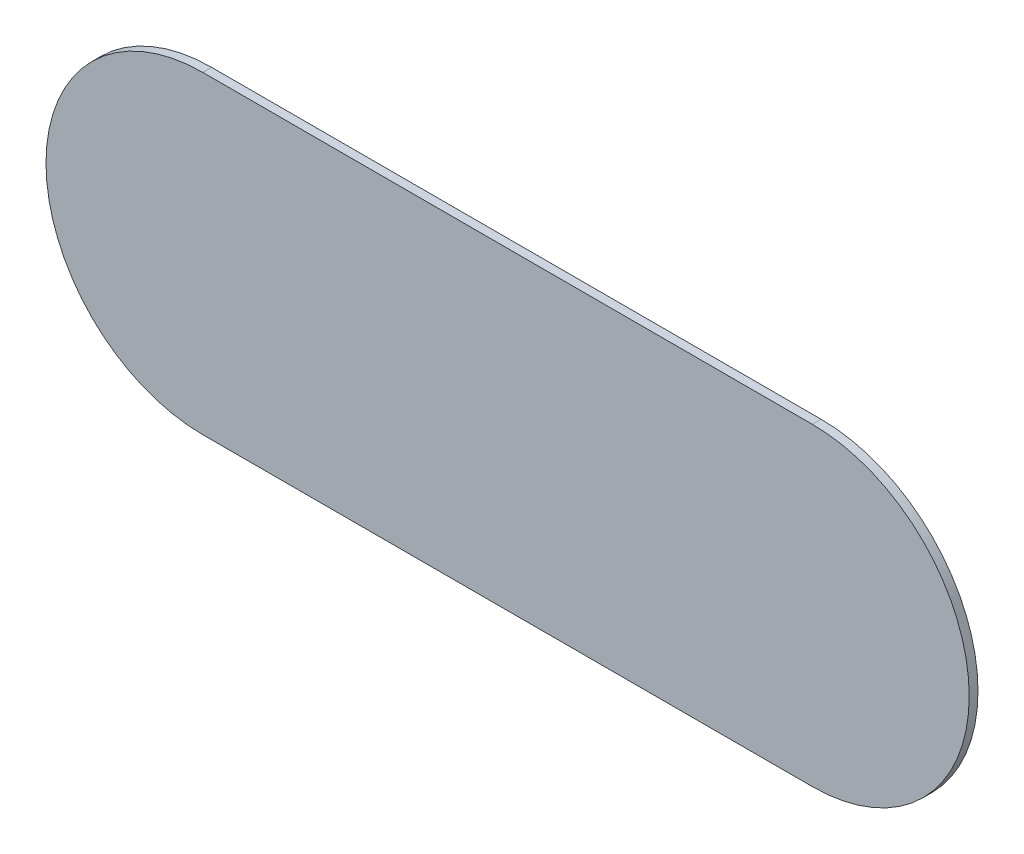
ISO-10303-21;
HEADER;
FILE_DESCRIPTION(('STEP AP214'),'2;1');
FILE_NAME('part.step','',(''),(''),'','','');
FILE_SCHEMA(('AUTOMOTIVE_DESIGN { 1 0 10303 214 1 1 1 1 }'));
ENDSEC;
DATA;
#1=APPLICATION_CONTEXT('core data for automotive mechanical design processes');
#2=APPLICATION_PROTOCOL_DEFINITION('international standard','automotive_design',2000,#1);
#3=PRODUCT_CONTEXT('',#1,'mechanical');
#4=PRODUCT('Part','Part','',(#3));
#5=PRODUCT_RELATED_PRODUCT_CATEGORY('part','',(#4));
#6=PRODUCT_DEFINITION_FORMATION('','',#4);
#7=PRODUCT_DEFINITION_CONTEXT('part definition',#1,'design');
#8=PRODUCT_DEFINITION('design','',#6,#7);
#9=PRODUCT_DEFINITION_SHAPE('','',#8);
#10=(LENGTH_UNIT() NAMED_UNIT(*) SI_UNIT(.MILLI.,.METRE.));
#11=(NAMED_UNIT(*) PLANE_ANGLE_UNIT() SI_UNIT($,.RADIAN.));
#12=(NAMED_UNIT(*) SI_UNIT($,.STERADIAN.) SOLID_ANGLE_UNIT());
#13=UNCERTAINTY_MEASURE_WITH_UNIT(LENGTH_MEASURE(1.E-05),#10,'distance_accuracy_value','');
#14=(GEOMETRIC_REPRESENTATION_CONTEXT(3) GLOBAL_UNCERTAINTY_ASSIGNED_CONTEXT((#13)) GLOBAL_UNIT_ASSIGNED_CONTEXT((#10,
#11,#12)) REPRESENTATION_CONTEXT('',''));
#15=CARTESIAN_POINT('',(0.,0.,0.));
#16=DIRECTION('',(0.,0.,1.));
#17=DIRECTION('',(1.,0.,0.));
#18=AXIS2_PLACEMENT_3D('',#15,#16,#17);
#19=CARTESIAN_POINT('',(115.091676,-117.711176,1.635));
#20=DIRECTION('',(0.,0.,1.));
#21=DIRECTION('',(1.,0.,0.));
#22=AXIS2_PLACEMENT_3D('',#19,#20,#21);
#23=PLANE('',#22);
#24=DIRECTION('',(-1.,0.,0.));
#25=VECTOR('',#24,1.);
#26=CARTESIAN_POINT('',(115.091676,-117.711176,1.635));
#27=LINE('',#26,#25);
#28=CARTESIAN_POINT('',(115.091676,-117.711176,1.635));
#29=VERTEX_POINT('',#28);
#30=CARTESIAN_POINT('',(112.663824,-117.711176,1.635));
#31=VERTEX_POINT('',#30);
#32=EDGE_CURVE('E94',#29,#31,#27,.T.);
#33=ORIENTED_EDGE('',*,*,#32,.T.);
#34=CARTESIAN_POINT('',(112.663824,-118.336176,1.635));
#35=DIRECTION('',(0.,0.,1.));
#36=DIRECTION('',(0.,1.,0.));
#37=AXIS2_PLACEMENT_3D('',#34,#35,#36);
#38=CIRCLE('',#37,0.625);
#39=CARTESIAN_POINT('',(112.663824,-118.961176,1.635));
#40=VERTEX_POINT('',#39);
#41=EDGE_CURVE('E74',#31,#40,#38,.T.);
#42=ORIENTED_EDGE('',*,*,#41,.T.);
#43=DIRECTION('',(1.,0.,0.));
#44=VECTOR('',#43,1.);
#45=CARTESIAN_POINT('',(112.663824,-118.961176,1.635));
#46=LINE('',#45,#44);
#47=CARTESIAN_POINT('',(115.091676,-118.961176,1.635));
#48=VERTEX_POINT('',#47);
#49=EDGE_CURVE('E20',#40,#48,#46,.T.);
#50=ORIENTED_EDGE('',*,*,#49,.T.);
#51=CARTESIAN_POINT('',(115.091676,-118.336176,1.635));
#52=DIRECTION('',(0.,0.,1.));
#53=DIRECTION('',(0.,-1.,0.));
#54=AXIS2_PLACEMENT_3D('',#51,#52,#53);
#55=CIRCLE('',#54,0.625);
#56=EDGE_CURVE('E11',#48,#29,#55,.T.);
#57=ORIENTED_EDGE('',*,*,#56,.T.);
#58=EDGE_LOOP('',(#33,#42,#50,#57));
#59=FACE_BOUND('',#58,.T.);
#60=ADVANCED_FACE('F17',(#59),#23,.T.);
#61=CARTESIAN_POINT('',(115.091676,-117.711176,1.6));
#62=DIRECTION('',(0.,0.,1.));
#63=DIRECTION('',(1.,0.,0.));
#64=AXIS2_PLACEMENT_3D('',#61,#62,#63);
#65=PLANE('',#64);
#66=CARTESIAN_POINT('',(115.091676,-118.336176,1.6));
#67=DIRECTION('',(0.,0.,1.));
#68=DIRECTION('',(0.,-1.,0.));
#69=AXIS2_PLACEMENT_3D('',#66,#67,#68);
#70=CIRCLE('',#69,0.625);
#71=CARTESIAN_POINT('',(115.091676,-118.961176,1.6));
#72=VERTEX_POINT('',#71);
#73=CARTESIAN_POINT('',(115.091676,-117.711176,1.6));
#74=VERTEX_POINT('',#73);
#75=EDGE_CURVE('E26',#72,#74,#70,.T.);
#76=ORIENTED_EDGE('',*,*,#75,.F.);
#77=DIRECTION('',(1.,0.,0.));
#78=VECTOR('',#77,1.);
#79=CARTESIAN_POINT('',(112.663824,-118.961176,1.6));
#80=LINE('',#79,#78);
#81=CARTESIAN_POINT('',(112.663824,-118.961176,1.6));
#82=VERTEX_POINT('',#81);
#83=EDGE_CURVE('E59',#82,#72,#80,.T.);
#84=ORIENTED_EDGE('',*,*,#83,.F.);
#85=CARTESIAN_POINT('',(112.663824,-118.336176,1.6));
#86=DIRECTION('',(0.,0.,1.));
#87=DIRECTION('',(0.,1.,0.));
#88=AXIS2_PLACEMENT_3D('',#85,#86,#87);
#89=CIRCLE('',#88,0.625);
#90=CARTESIAN_POINT('',(112.663824,-117.711176,1.6));
#91=VERTEX_POINT('',#90);
#92=EDGE_CURVE('E96',#91,#82,#89,.T.);
#93=ORIENTED_EDGE('',*,*,#92,.F.);
#94=DIRECTION('',(-1.,0.,0.));
#95=VECTOR('',#94,1.);
#96=CARTESIAN_POINT('',(115.091676,-117.711176,1.6));
#97=LINE('',#96,#95);
#98=EDGE_CURVE('E93',#74,#91,#97,.T.);
#99=ORIENTED_EDGE('',*,*,#98,.F.);
#100=EDGE_LOOP('',(#76,#84,#93,#99));
#101=FACE_BOUND('',#100,.T.);
#102=ADVANCED_FACE('F98',(#101),#65,.F.);
#103=CARTESIAN_POINT('',(115.091676,-118.336176,1.6));
#104=DIRECTION('',(0.,0.,-1.));
#105=DIRECTION('',(0.,-1.,0.));
#106=AXIS2_PLACEMENT_3D('',#103,#104,#105);
#107=CYLINDRICAL_SURFACE('',#106,0.625);
#108=ORIENTED_EDGE('',*,*,#75,.T.);
#109=DIRECTION('',(0.,0.,1.));
#110=VECTOR('',#109,1.);
#111=CARTESIAN_POINT('',(115.091676,-117.711176,1.6));
#112=LINE('',#111,#110);
#113=EDGE_CURVE('E83',#74,#29,#112,.T.);
#114=ORIENTED_EDGE('',*,*,#113,.T.);
#115=ORIENTED_EDGE('',*,*,#56,.F.);
#116=DIRECTION('',(0.,0.,1.));
#117=VECTOR('',#116,1.);
#118=CARTESIAN_POINT('',(115.091676,-118.961176,1.6));
#119=LINE('',#118,#117);
#120=EDGE_CURVE('E86',#72,#48,#119,.T.);
#121=ORIENTED_EDGE('',*,*,#120,.F.);
#122=EDGE_LOOP('',(#108,#114,#115,#121));
#123=FACE_BOUND('',#122,.T.);
#124=ADVANCED_FACE('F82',(#123),#107,.T.);
#125=CARTESIAN_POINT('',(112.663824,-118.961176,1.6));
#126=DIRECTION('',(0.,1.,0.));
#127=DIRECTION('',(1.,0.,0.));
#128=AXIS2_PLACEMENT_3D('',#125,#126,#127);
#129=PLANE('',#128);
#130=ORIENTED_EDGE('',*,*,#83,.T.);
#131=ORIENTED_EDGE('',*,*,#120,.T.);
#132=ORIENTED_EDGE('',*,*,#49,.F.);
#133=DIRECTION('',(0.,0.,1.));
#134=VECTOR('',#133,1.);
#135=CARTESIAN_POINT('',(112.663824,-118.961176,1.6));
#136=LINE('',#135,#134);
#137=EDGE_CURVE('E114',#82,#40,#136,.T.);
#138=ORIENTED_EDGE('',*,*,#137,.F.);
#139=EDGE_LOOP('',(#130,#131,#132,#138));
#140=FACE_BOUND('',#139,.T.);
#141=ADVANCED_FACE('F128',(#140),#129,.F.);
#142=CARTESIAN_POINT('',(112.663824,-118.336176,1.6));
#143=DIRECTION('',(0.,0.,-1.));
#144=DIRECTION('',(0.,1.,0.));
#145=AXIS2_PLACEMENT_3D('',#142,#143,#144);
#146=CYLINDRICAL_SURFACE('',#145,0.625);
#147=ORIENTED_EDGE('',*,*,#92,.T.);
#148=ORIENTED_EDGE('',*,*,#137,.T.);
#149=ORIENTED_EDGE('',*,*,#41,.F.);
#150=DIRECTION('',(0.,0.,1.));
#151=VECTOR('',#150,1.);
#152=CARTESIAN_POINT('',(112.663824,-117.711176,1.6));
#153=LINE('',#152,#151);
#154=EDGE_CURVE('E101',#91,#31,#153,.T.);
#155=ORIENTED_EDGE('',*,*,#154,.F.);
#156=EDGE_LOOP('',(#147,#148,#149,#155));
#157=FACE_BOUND('',#156,.T.);
#158=ADVANCED_FACE('F129',(#157),#146,.T.);
#159=CARTESIAN_POINT('',(115.091676,-117.711176,1.6));
#160=DIRECTION('',(0.,-1.,0.));
#161=DIRECTION('',(0.,0.,-1.));
#162=AXIS2_PLACEMENT_3D('',#159,#160,#161);
#163=PLANE('',#162);
#164=ORIENTED_EDGE('',*,*,#98,.T.);
#165=ORIENTED_EDGE('',*,*,#154,.T.);
#166=ORIENTED_EDGE('',*,*,#32,.F.);
#167=ORIENTED_EDGE('',*,*,#113,.F.);
#168=EDGE_LOOP('',(#164,#165,#166,#167));
#169=FACE_BOUND('',#168,.T.);
#170=ADVANCED_FACE('F91',(#169),#163,.F.);
#171=CLOSED_SHELL('',(#60,#102,#124,#141,#158,#170));
#172=MANIFOLD_SOLID_BREP('B1',#171);
#173=ADVANCED_BREP_SHAPE_REPRESENTATION('',(#18,#172),#14);
#174=SHAPE_DEFINITION_REPRESENTATION(#9,#173);
ENDSEC;
END-ISO-10303-21;
